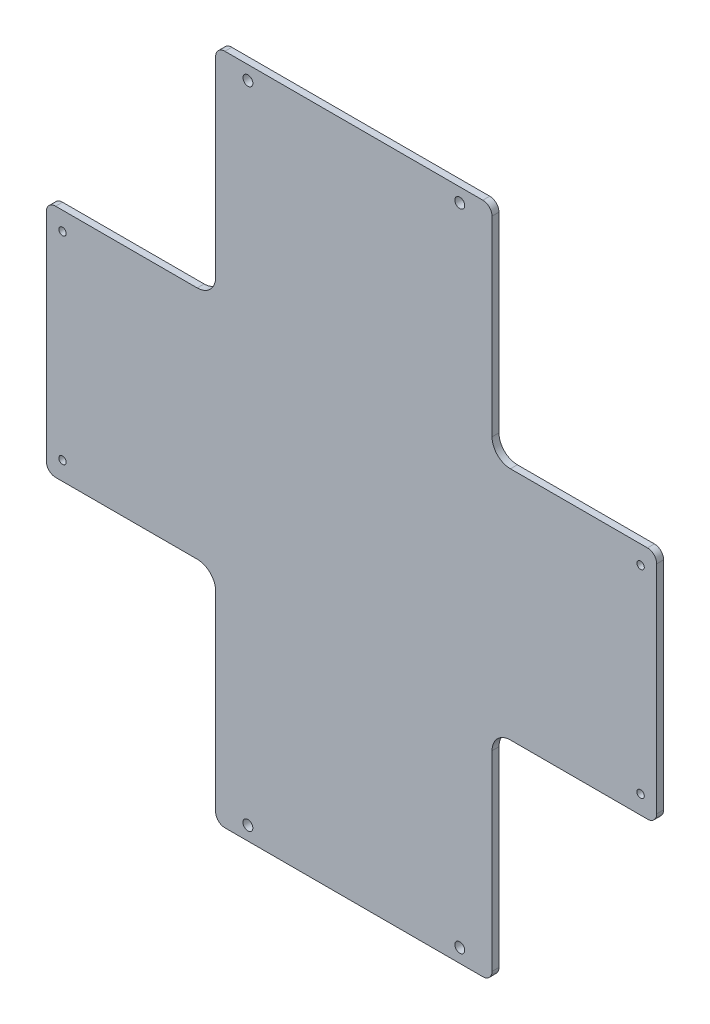
ISO-10303-21;
HEADER;
FILE_DESCRIPTION(('STEP AP214'),'2;1');
FILE_NAME('part.step','',(''),(''),'','','');
FILE_SCHEMA(('AUTOMOTIVE_DESIGN { 1 0 10303 214 1 1 1 1 }'));
ENDSEC;
DATA;
#1=APPLICATION_CONTEXT('core data for automotive mechanical design processes');
#2=APPLICATION_PROTOCOL_DEFINITION('international standard','automotive_design',2000,#1);
#3=PRODUCT_CONTEXT('',#1,'mechanical');
#4=PRODUCT('Part','Part','',(#3));
#5=PRODUCT_RELATED_PRODUCT_CATEGORY('part','',(#4));
#6=PRODUCT_DEFINITION_FORMATION('','',#4);
#7=PRODUCT_DEFINITION_CONTEXT('part definition',#1,'design');
#8=PRODUCT_DEFINITION('design','',#6,#7);
#9=PRODUCT_DEFINITION_SHAPE('','',#8);
#10=(LENGTH_UNIT() NAMED_UNIT(*) SI_UNIT(.MILLI.,.METRE.));
#11=(NAMED_UNIT(*) PLANE_ANGLE_UNIT() SI_UNIT($,.RADIAN.));
#12=(NAMED_UNIT(*) SI_UNIT($,.STERADIAN.) SOLID_ANGLE_UNIT());
#13=UNCERTAINTY_MEASURE_WITH_UNIT(LENGTH_MEASURE(1.E-05),#10,'distance_accuracy_value','');
#14=(GEOMETRIC_REPRESENTATION_CONTEXT(3) GLOBAL_UNCERTAINTY_ASSIGNED_CONTEXT((#13)) GLOBAL_UNIT_ASSIGNED_CONTEXT((#10,
#11,#12)) REPRESENTATION_CONTEXT('',''));
#15=CARTESIAN_POINT('',(0.,0.,0.));
#16=DIRECTION('',(0.,0.,1.));
#17=DIRECTION('',(1.,0.,0.));
#18=AXIS2_PLACEMENT_3D('',#15,#16,#17);
#19=CARTESIAN_POINT('',(-50.,-142.,3.));
#20=DIRECTION('',(0.,0.,1.));
#21=DIRECTION('',(1.,0.,0.));
#22=AXIS2_PLACEMENT_3D('',#19,#20,#21);
#23=PLANE('',#22);
#24=CARTESIAN_POINT('',(-40.,-140.,3.));
#25=DIRECTION('',(0.,0.,1.));
#26=DIRECTION('',(1.,0.,0.));
#27=AXIS2_PLACEMENT_3D('',#24,#25,#26);
#28=CIRCLE('',#27,2.15);
#29=CARTESIAN_POINT('',(-37.85,-140.,3.));
#30=VERTEX_POINT('',#29);
#31=EDGE_CURVE('E546',#30,#30,#28,.T.);
#32=ORIENTED_EDGE('',*,*,#31,.F.);
#33=EDGE_LOOP('',(#32));
#34=FACE_BOUND('',#33,.T.);
#35=CARTESIAN_POINT('',(-120.5,-43.,3.));
#36=DIRECTION('',(0.,0.,1.));
#37=DIRECTION('',(1.,0.,0.));
#38=AXIS2_PLACEMENT_3D('',#35,#36,#37);
#39=CIRCLE('',#38,1.6);
#40=CARTESIAN_POINT('',(-118.9,-43.,3.));
#41=VERTEX_POINT('',#40);
#42=EDGE_CURVE('E565',#41,#41,#39,.T.);
#43=ORIENTED_EDGE('',*,*,#42,.F.);
#44=EDGE_LOOP('',(#43));
#45=FACE_BOUND('',#44,.T.);
#46=CARTESIAN_POINT('',(-120.5,43.,3.));
#47=DIRECTION('',(0.,0.,1.));
#48=DIRECTION('',(1.,0.,0.));
#49=AXIS2_PLACEMENT_3D('',#46,#47,#48);
#50=CIRCLE('',#49,1.6);
#51=CARTESIAN_POINT('',(-118.9,43.,3.));
#52=VERTEX_POINT('',#51);
#53=EDGE_CURVE('E576',#52,#52,#50,.T.);
#54=ORIENTED_EDGE('',*,*,#53,.F.);
#55=EDGE_LOOP('',(#54));
#56=FACE_BOUND('',#55,.T.);
#57=CARTESIAN_POINT('',(-40.,140.,3.));
#58=DIRECTION('',(0.,0.,1.));
#59=DIRECTION('',(1.,0.,0.));
#60=AXIS2_PLACEMENT_3D('',#57,#58,#59);
#61=CIRCLE('',#60,2.15);
#62=CARTESIAN_POINT('',(-37.85,140.,3.));
#63=VERTEX_POINT('',#62);
#64=EDGE_CURVE('E246',#63,#63,#61,.T.);
#65=ORIENTED_EDGE('',*,*,#64,.F.);
#66=EDGE_LOOP('',(#65));
#67=FACE_BOUND('',#66,.T.);
#68=CARTESIAN_POINT('',(-50.,-142.,3.));
#69=DIRECTION('',(0.,0.,1.));
#70=DIRECTION('',(1.,0.,0.));
#71=AXIS2_PLACEMENT_3D('',#68,#69,#70);
#72=CIRCLE('',#71,4.);
#73=CARTESIAN_POINT('',(-54.,-142.,3.));
#74=VERTEX_POINT('',#73);
#75=CARTESIAN_POINT('',(-50.,-146.,3.));
#76=VERTEX_POINT('',#75);
#77=EDGE_CURVE('E314',#74,#76,#72,.T.);
#78=ORIENTED_EDGE('',*,*,#77,.T.);
#79=DIRECTION('',(1.,0.,0.));
#80=VECTOR('',#79,1.);
#81=CARTESIAN_POINT('',(-50.,-146.,3.));
#82=LINE('',#81,#80);
#83=CARTESIAN_POINT('',(62.,-146.,3.));
#84=VERTEX_POINT('',#83);
#85=EDGE_CURVE('E152',#76,#84,#82,.T.);
#86=ORIENTED_EDGE('',*,*,#85,.T.);
#87=CARTESIAN_POINT('',(62.,-142.,3.));
#88=DIRECTION('',(0.,0.,1.));
#89=DIRECTION('',(1.,0.,0.));
#90=AXIS2_PLACEMENT_3D('',#87,#88,#89);
#91=CIRCLE('',#90,4.);
#92=CARTESIAN_POINT('',(66.,-142.,3.));
#93=VERTEX_POINT('',#92);
#94=EDGE_CURVE('E397',#84,#93,#91,.T.);
#95=ORIENTED_EDGE('',*,*,#94,.T.);
#96=DIRECTION('',(0.,1.,0.));
#97=VECTOR('',#96,1.);
#98=CARTESIAN_POINT('',(66.,-142.,3.));
#99=LINE('',#98,#97);
#100=CARTESIAN_POINT('',(66.,-59.,3.));
#101=VERTEX_POINT('',#100);
#102=EDGE_CURVE('E420',#93,#101,#99,.T.);
#103=ORIENTED_EDGE('',*,*,#102,.T.);
#104=CARTESIAN_POINT('',(74.,-59.,3.));
#105=DIRECTION('',(0.,0.,-1.));
#106=DIRECTION('',(-1.,0.,0.));
#107=AXIS2_PLACEMENT_3D('',#104,#105,#106);
#108=CIRCLE('',#107,8.);
#109=CARTESIAN_POINT('',(74.,-51.,3.));
#110=VERTEX_POINT('',#109);
#111=EDGE_CURVE('E414',#101,#110,#108,.T.);
#112=ORIENTED_EDGE('',*,*,#111,.T.);
#113=DIRECTION('',(1.,0.,0.));
#114=VECTOR('',#113,1.);
#115=CARTESIAN_POINT('',(74.,-51.,3.));
#116=LINE('',#115,#114);
#117=CARTESIAN_POINT('',(133.5,-51.,3.));
#118=VERTEX_POINT('',#117);
#119=EDGE_CURVE('E416',#110,#118,#116,.T.);
#120=ORIENTED_EDGE('',*,*,#119,.T.);
#121=CARTESIAN_POINT('',(133.5,-47.,3.));
#122=DIRECTION('',(0.,0.,1.));
#123=DIRECTION('',(1.,0.,0.));
#124=AXIS2_PLACEMENT_3D('',#121,#122,#123);
#125=CIRCLE('',#124,4.);
#126=CARTESIAN_POINT('',(137.5,-47.,3.));
#127=VERTEX_POINT('',#126);
#128=EDGE_CURVE('E421',#118,#127,#125,.T.);
#129=ORIENTED_EDGE('',*,*,#128,.T.);
#130=DIRECTION('',(0.,1.,0.));
#131=VECTOR('',#130,1.);
#132=CARTESIAN_POINT('',(137.5,-47.,3.));
#133=LINE('',#132,#131);
#134=CARTESIAN_POINT('',(137.5,47.,3.));
#135=VERTEX_POINT('',#134);
#136=EDGE_CURVE('E429',#127,#135,#133,.T.);
#137=ORIENTED_EDGE('',*,*,#136,.T.);
#138=CARTESIAN_POINT('',(133.5,47.,3.));
#139=DIRECTION('',(0.,0.,1.));
#140=DIRECTION('',(1.,0.,0.));
#141=AXIS2_PLACEMENT_3D('',#138,#139,#140);
#142=CIRCLE('',#141,4.);
#143=CARTESIAN_POINT('',(133.5,51.,3.));
#144=VERTEX_POINT('',#143);
#145=EDGE_CURVE('E433',#135,#144,#142,.T.);
#146=ORIENTED_EDGE('',*,*,#145,.T.);
#147=DIRECTION('',(-1.,0.,0.));
#148=VECTOR('',#147,1.);
#149=CARTESIAN_POINT('',(133.5,51.,3.));
#150=LINE('',#149,#148);
#151=CARTESIAN_POINT('',(74.,51.,3.));
#152=VERTEX_POINT('',#151);
#153=EDGE_CURVE('E436',#144,#152,#150,.T.);
#154=ORIENTED_EDGE('',*,*,#153,.T.);
#155=CARTESIAN_POINT('',(74.,59.,3.));
#156=DIRECTION('',(0.,0.,-1.));
#157=DIRECTION('',(-1.,0.,0.));
#158=AXIS2_PLACEMENT_3D('',#155,#156,#157);
#159=CIRCLE('',#158,8.);
#160=CARTESIAN_POINT('',(66.,59.,3.));
#161=VERTEX_POINT('',#160);
#162=EDGE_CURVE('E438',#152,#161,#159,.T.);
#163=ORIENTED_EDGE('',*,*,#162,.T.);
#164=DIRECTION('',(0.,1.,0.));
#165=VECTOR('',#164,1.);
#166=CARTESIAN_POINT('',(66.,59.,3.));
#167=LINE('',#166,#165);
#168=CARTESIAN_POINT('',(66.,142.,3.));
#169=VERTEX_POINT('',#168);
#170=EDGE_CURVE('E445',#161,#169,#167,.T.);
#171=ORIENTED_EDGE('',*,*,#170,.T.);
#172=CARTESIAN_POINT('',(62.,142.,3.));
#173=DIRECTION('',(0.,0.,1.));
#174=DIRECTION('',(1.,0.,0.));
#175=AXIS2_PLACEMENT_3D('',#172,#173,#174);
#176=CIRCLE('',#175,4.);
#177=CARTESIAN_POINT('',(62.,146.,3.));
#178=VERTEX_POINT('',#177);
#179=EDGE_CURVE('E443',#169,#178,#176,.T.);
#180=ORIENTED_EDGE('',*,*,#179,.T.);
#181=DIRECTION('',(-1.,0.,0.));
#182=VECTOR('',#181,1.);
#183=CARTESIAN_POINT('',(62.,146.,3.));
#184=LINE('',#183,#182);
#185=CARTESIAN_POINT('',(-50.,146.,3.));
#186=VERTEX_POINT('',#185);
#187=EDGE_CURVE('E449',#178,#186,#184,.T.);
#188=ORIENTED_EDGE('',*,*,#187,.T.);
#189=CARTESIAN_POINT('',(-50.,142.,3.));
#190=DIRECTION('',(0.,0.,1.));
#191=DIRECTION('',(1.,0.,0.));
#192=AXIS2_PLACEMENT_3D('',#189,#190,#191);
#193=CIRCLE('',#192,4.);
#194=CARTESIAN_POINT('',(-54.,142.,3.));
#195=VERTEX_POINT('',#194);
#196=EDGE_CURVE('E453',#186,#195,#193,.T.);
#197=ORIENTED_EDGE('',*,*,#196,.T.);
#198=DIRECTION('',(0.,-1.,0.));
#199=VECTOR('',#198,1.);
#200=CARTESIAN_POINT('',(-54.,142.,3.));
#201=LINE('',#200,#199);
#202=CARTESIAN_POINT('',(-54.,59.,3.));
#203=VERTEX_POINT('',#202);
#204=EDGE_CURVE('E452',#195,#203,#201,.T.);
#205=ORIENTED_EDGE('',*,*,#204,.T.);
#206=CARTESIAN_POINT('',(-62.,59.,3.));
#207=DIRECTION('',(0.,0.,-1.));
#208=DIRECTION('',(-1.,0.,0.));
#209=AXIS2_PLACEMENT_3D('',#206,#207,#208);
#210=CIRCLE('',#209,8.);
#211=CARTESIAN_POINT('',(-62.,51.,3.));
#212=VERTEX_POINT('',#211);
#213=EDGE_CURVE('E460',#203,#212,#210,.T.);
#214=ORIENTED_EDGE('',*,*,#213,.T.);
#215=DIRECTION('',(-1.,0.,0.));
#216=VECTOR('',#215,1.);
#217=CARTESIAN_POINT('',(-62.,51.,3.));
#218=LINE('',#217,#216);
#219=CARTESIAN_POINT('',(-123.5,51.,3.));
#220=VERTEX_POINT('',#219);
#221=EDGE_CURVE('E458',#212,#220,#218,.T.);
#222=ORIENTED_EDGE('',*,*,#221,.T.);
#223=CARTESIAN_POINT('',(-123.5,47.,3.));
#224=DIRECTION('',(0.,0.,1.));
#225=DIRECTION('',(1.,0.,0.));
#226=AXIS2_PLACEMENT_3D('',#223,#224,#225);
#227=CIRCLE('',#226,4.);
#228=CARTESIAN_POINT('',(-127.5,47.,3.));
#229=VERTEX_POINT('',#228);
#230=EDGE_CURVE('E464',#220,#229,#227,.T.);
#231=ORIENTED_EDGE('',*,*,#230,.T.);
#232=DIRECTION('',(0.,-1.,0.));
#233=VECTOR('',#232,1.);
#234=CARTESIAN_POINT('',(-127.5,47.,3.));
#235=LINE('',#234,#233);
#236=CARTESIAN_POINT('',(-127.5,-47.,3.));
#237=VERTEX_POINT('',#236);
#238=EDGE_CURVE('E468',#229,#237,#235,.T.);
#239=ORIENTED_EDGE('',*,*,#238,.T.);
#240=CARTESIAN_POINT('',(-123.5,-47.,3.));
#241=DIRECTION('',(0.,0.,1.));
#242=DIRECTION('',(1.,0.,0.));
#243=AXIS2_PLACEMENT_3D('',#240,#241,#242);
#244=CIRCLE('',#243,4.);
#245=CARTESIAN_POINT('',(-123.5,-51.,3.));
#246=VERTEX_POINT('',#245);
#247=EDGE_CURVE('E222',#237,#246,#244,.T.);
#248=ORIENTED_EDGE('',*,*,#247,.T.);
#249=DIRECTION('',(1.,0.,0.));
#250=VECTOR('',#249,1.);
#251=CARTESIAN_POINT('',(-123.5,-51.,3.));
#252=LINE('',#251,#250);
#253=CARTESIAN_POINT('',(-62.,-51.,3.));
#254=VERTEX_POINT('',#253);
#255=EDGE_CURVE('E214',#246,#254,#252,.T.);
#256=ORIENTED_EDGE('',*,*,#255,.T.);
#257=CARTESIAN_POINT('',(-62.,-59.,3.));
#258=DIRECTION('',(0.,0.,-1.));
#259=DIRECTION('',(-1.,0.,0.));
#260=AXIS2_PLACEMENT_3D('',#257,#258,#259);
#261=CIRCLE('',#260,8.);
#262=CARTESIAN_POINT('',(-54.,-59.,3.));
#263=VERTEX_POINT('',#262);
#264=EDGE_CURVE('E218',#254,#263,#261,.T.);
#265=ORIENTED_EDGE('',*,*,#264,.T.);
#266=DIRECTION('',(0.,-1.,0.));
#267=VECTOR('',#266,1.);
#268=CARTESIAN_POINT('',(-54.,-59.,3.));
#269=LINE('',#268,#267);
#270=EDGE_CURVE('E64',#263,#74,#269,.T.);
#271=ORIENTED_EDGE('',*,*,#270,.T.);
#272=EDGE_LOOP('',(#78,#86,#95,#103,#112,#120,#129,#137,#146,#154,#163,#171,#180,#188,#197,#205,
#214,#222,#231,#239,#248,#256,#265,#271));
#273=FACE_BOUND('',#272,.T.);
#274=CARTESIAN_POINT('',(52.,140.,3.));
#275=DIRECTION('',(0.,0.,1.));
#276=DIRECTION('',(1.,0.,0.));
#277=AXIS2_PLACEMENT_3D('',#274,#275,#276);
#278=CIRCLE('',#277,2.15);
#279=CARTESIAN_POINT('',(54.15,140.,3.));
#280=VERTEX_POINT('',#279);
#281=EDGE_CURVE('E588',#280,#280,#278,.T.);
#282=ORIENTED_EDGE('',*,*,#281,.F.);
#283=EDGE_LOOP('',(#282));
#284=FACE_BOUND('',#283,.T.);
#285=CARTESIAN_POINT('',(130.5,43.,3.));
#286=DIRECTION('',(0.,0.,1.));
#287=DIRECTION('',(1.,0.,0.));
#288=AXIS2_PLACEMENT_3D('',#285,#286,#287);
#289=CIRCLE('',#288,1.59999999999999);
#290=CARTESIAN_POINT('',(132.1,43.,3.));
#291=VERTEX_POINT('',#290);
#292=EDGE_CURVE('E568',#291,#291,#289,.T.);
#293=ORIENTED_EDGE('',*,*,#292,.F.);
#294=EDGE_LOOP('',(#293));
#295=FACE_BOUND('',#294,.T.);
#296=CARTESIAN_POINT('',(130.5,-43.,3.));
#297=DIRECTION('',(0.,0.,1.));
#298=DIRECTION('',(1.,0.,0.));
#299=AXIS2_PLACEMENT_3D('',#296,#297,#298);
#300=CIRCLE('',#299,1.59999999999999);
#301=CARTESIAN_POINT('',(132.1,-43.,3.));
#302=VERTEX_POINT('',#301);
#303=EDGE_CURVE('E551',#302,#302,#300,.T.);
#304=ORIENTED_EDGE('',*,*,#303,.F.);
#305=EDGE_LOOP('',(#304));
#306=FACE_BOUND('',#305,.T.);
#307=CARTESIAN_POINT('',(52.,-140.,3.));
#308=DIRECTION('',(0.,0.,1.));
#309=DIRECTION('',(1.,0.,0.));
#310=AXIS2_PLACEMENT_3D('',#307,#308,#309);
#311=CIRCLE('',#310,2.15);
#312=CARTESIAN_POINT('',(54.15,-140.,3.));
#313=VERTEX_POINT('',#312);
#314=EDGE_CURVE('E532',#313,#313,#311,.T.);
#315=ORIENTED_EDGE('',*,*,#314,.F.);
#316=EDGE_LOOP('',(#315));
#317=FACE_BOUND('',#316,.T.);
#318=ADVANCED_FACE('F44',(#34,#45,#56,#67,#273,#284,#295,#306,#317),#23,.T.);
#319=CARTESIAN_POINT('',(-50.,-142.,0.));
#320=DIRECTION('',(0.,0.,1.));
#321=DIRECTION('',(1.,0.,0.));
#322=AXIS2_PLACEMENT_3D('',#319,#320,#321);
#323=PLANE('',#322);
#324=CARTESIAN_POINT('',(-50.,-142.,0.));
#325=DIRECTION('',(0.,0.,1.));
#326=DIRECTION('',(1.,0.,0.));
#327=AXIS2_PLACEMENT_3D('',#324,#325,#326);
#328=CIRCLE('',#327,4.);
#329=CARTESIAN_POINT('',(-54.,-142.,0.));
#330=VERTEX_POINT('',#329);
#331=CARTESIAN_POINT('',(-50.,-146.,0.));
#332=VERTEX_POINT('',#331);
#333=EDGE_CURVE('E244',#330,#332,#328,.T.);
#334=ORIENTED_EDGE('',*,*,#333,.F.);
#335=DIRECTION('',(0.,-1.,0.));
#336=VECTOR('',#335,1.);
#337=CARTESIAN_POINT('',(-54.,-59.,0.));
#338=LINE('',#337,#336);
#339=CARTESIAN_POINT('',(-54.,-59.,0.));
#340=VERTEX_POINT('',#339);
#341=EDGE_CURVE('E148',#340,#330,#338,.T.);
#342=ORIENTED_EDGE('',*,*,#341,.F.);
#343=CARTESIAN_POINT('',(-62.,-59.,0.));
#344=DIRECTION('',(0.,0.,-1.));
#345=DIRECTION('',(-1.,0.,0.));
#346=AXIS2_PLACEMENT_3D('',#343,#344,#345);
#347=CIRCLE('',#346,8.);
#348=CARTESIAN_POINT('',(-62.,-51.,0.));
#349=VERTEX_POINT('',#348);
#350=EDGE_CURVE('E139',#349,#340,#347,.T.);
#351=ORIENTED_EDGE('',*,*,#350,.F.);
#352=DIRECTION('',(1.,0.,0.));
#353=VECTOR('',#352,1.);
#354=CARTESIAN_POINT('',(-123.5,-51.,0.));
#355=LINE('',#354,#353);
#356=CARTESIAN_POINT('',(-123.5,-51.,0.));
#357=VERTEX_POINT('',#356);
#358=EDGE_CURVE('E230',#357,#349,#355,.T.);
#359=ORIENTED_EDGE('',*,*,#358,.F.);
#360=CARTESIAN_POINT('',(-123.5,-47.,0.));
#361=DIRECTION('',(0.,0.,1.));
#362=DIRECTION('',(1.,0.,0.));
#363=AXIS2_PLACEMENT_3D('',#360,#361,#362);
#364=CIRCLE('',#363,4.);
#365=CARTESIAN_POINT('',(-127.5,-47.,0.));
#366=VERTEX_POINT('',#365);
#367=EDGE_CURVE('E304',#366,#357,#364,.T.);
#368=ORIENTED_EDGE('',*,*,#367,.F.);
#369=DIRECTION('',(0.,-1.,0.));
#370=VECTOR('',#369,1.);
#371=CARTESIAN_POINT('',(-127.5,47.,0.));
#372=LINE('',#371,#370);
#373=CARTESIAN_POINT('',(-127.5,47.,0.));
#374=VERTEX_POINT('',#373);
#375=EDGE_CURVE('E305',#374,#366,#372,.T.);
#376=ORIENTED_EDGE('',*,*,#375,.F.);
#377=CARTESIAN_POINT('',(-123.5,47.,0.));
#378=DIRECTION('',(0.,0.,1.));
#379=DIRECTION('',(1.,0.,0.));
#380=AXIS2_PLACEMENT_3D('',#377,#378,#379);
#381=CIRCLE('',#380,4.);
#382=CARTESIAN_POINT('',(-123.5,51.,0.));
#383=VERTEX_POINT('',#382);
#384=EDGE_CURVE('E298',#383,#374,#381,.T.);
#385=ORIENTED_EDGE('',*,*,#384,.F.);
#386=DIRECTION('',(-1.,0.,0.));
#387=VECTOR('',#386,1.);
#388=CARTESIAN_POINT('',(-62.,51.,0.));
#389=LINE('',#388,#387);
#390=CARTESIAN_POINT('',(-62.,51.,0.));
#391=VERTEX_POINT('',#390);
#392=EDGE_CURVE('E296',#391,#383,#389,.T.);
#393=ORIENTED_EDGE('',*,*,#392,.F.);
#394=CARTESIAN_POINT('',(-62.,59.,0.));
#395=DIRECTION('',(0.,0.,-1.));
#396=DIRECTION('',(-1.,0.,0.));
#397=AXIS2_PLACEMENT_3D('',#394,#395,#396);
#398=CIRCLE('',#397,8.);
#399=CARTESIAN_POINT('',(-54.,59.,0.));
#400=VERTEX_POINT('',#399);
#401=EDGE_CURVE('E291',#400,#391,#398,.T.);
#402=ORIENTED_EDGE('',*,*,#401,.F.);
#403=DIRECTION('',(0.,-1.,0.));
#404=VECTOR('',#403,1.);
#405=CARTESIAN_POINT('',(-54.,142.,0.));
#406=LINE('',#405,#404);
#407=CARTESIAN_POINT('',(-54.,142.,0.));
#408=VERTEX_POINT('',#407);
#409=EDGE_CURVE('E289',#408,#400,#406,.T.);
#410=ORIENTED_EDGE('',*,*,#409,.F.);
#411=CARTESIAN_POINT('',(-50.,142.,0.));
#412=DIRECTION('',(0.,0.,1.));
#413=DIRECTION('',(1.,0.,0.));
#414=AXIS2_PLACEMENT_3D('',#411,#412,#413);
#415=CIRCLE('',#414,4.);
#416=CARTESIAN_POINT('',(-50.,146.,0.));
#417=VERTEX_POINT('',#416);
#418=EDGE_CURVE('E290',#417,#408,#415,.T.);
#419=ORIENTED_EDGE('',*,*,#418,.F.);
#420=DIRECTION('',(-1.,0.,0.));
#421=VECTOR('',#420,1.);
#422=CARTESIAN_POINT('',(62.,146.,0.));
#423=LINE('',#422,#421);
#424=CARTESIAN_POINT('',(62.,146.,0.));
#425=VERTEX_POINT('',#424);
#426=EDGE_CURVE('E283',#425,#417,#423,.T.);
#427=ORIENTED_EDGE('',*,*,#426,.F.);
#428=CARTESIAN_POINT('',(62.,142.,0.));
#429=DIRECTION('',(0.,0.,1.));
#430=DIRECTION('',(1.,0.,0.));
#431=AXIS2_PLACEMENT_3D('',#428,#429,#430);
#432=CIRCLE('',#431,4.);
#433=CARTESIAN_POINT('',(66.,142.,0.));
#434=VERTEX_POINT('',#433);
#435=EDGE_CURVE('E281',#434,#425,#432,.T.);
#436=ORIENTED_EDGE('',*,*,#435,.F.);
#437=DIRECTION('',(0.,1.,0.));
#438=VECTOR('',#437,1.);
#439=CARTESIAN_POINT('',(66.,59.,0.));
#440=LINE('',#439,#438);
#441=CARTESIAN_POINT('',(66.,59.,0.));
#442=VERTEX_POINT('',#441);
#443=EDGE_CURVE('E279',#442,#434,#440,.T.);
#444=ORIENTED_EDGE('',*,*,#443,.F.);
#445=CARTESIAN_POINT('',(74.,59.,0.));
#446=DIRECTION('',(0.,0.,-1.));
#447=DIRECTION('',(-1.,0.,0.));
#448=AXIS2_PLACEMENT_3D('',#445,#446,#447);
#449=CIRCLE('',#448,8.);
#450=CARTESIAN_POINT('',(74.,51.,0.));
#451=VERTEX_POINT('',#450);
#452=EDGE_CURVE('E274',#451,#442,#449,.T.);
#453=ORIENTED_EDGE('',*,*,#452,.F.);
#454=DIRECTION('',(-1.,0.,0.));
#455=VECTOR('',#454,1.);
#456=CARTESIAN_POINT('',(133.5,51.,0.));
#457=LINE('',#456,#455);
#458=CARTESIAN_POINT('',(133.5,51.,0.));
#459=VERTEX_POINT('',#458);
#460=EDGE_CURVE('E275',#459,#451,#457,.T.);
#461=ORIENTED_EDGE('',*,*,#460,.F.);
#462=CARTESIAN_POINT('',(133.5,47.,0.));
#463=DIRECTION('',(0.,0.,1.));
#464=DIRECTION('',(1.,0.,0.));
#465=AXIS2_PLACEMENT_3D('',#462,#463,#464);
#466=CIRCLE('',#465,4.);
#467=CARTESIAN_POINT('',(137.5,47.,0.));
#468=VERTEX_POINT('',#467);
#469=EDGE_CURVE('E267',#468,#459,#466,.T.);
#470=ORIENTED_EDGE('',*,*,#469,.F.);
#471=DIRECTION('',(0.,1.,0.));
#472=VECTOR('',#471,1.);
#473=CARTESIAN_POINT('',(137.5,-47.,0.));
#474=LINE('',#473,#472);
#475=CARTESIAN_POINT('',(137.5,-47.,0.));
#476=VERTEX_POINT('',#475);
#477=EDGE_CURVE('E266',#476,#468,#474,.T.);
#478=ORIENTED_EDGE('',*,*,#477,.F.);
#479=CARTESIAN_POINT('',(133.5,-47.,0.));
#480=DIRECTION('',(0.,0.,1.));
#481=DIRECTION('',(1.,0.,0.));
#482=AXIS2_PLACEMENT_3D('',#479,#480,#481);
#483=CIRCLE('',#482,4.);
#484=CARTESIAN_POINT('',(133.5,-51.,0.));
#485=VERTEX_POINT('',#484);
#486=EDGE_CURVE('E263',#485,#476,#483,.T.);
#487=ORIENTED_EDGE('',*,*,#486,.F.);
#488=DIRECTION('',(1.,0.,0.));
#489=VECTOR('',#488,1.);
#490=CARTESIAN_POINT('',(74.,-51.,0.));
#491=LINE('',#490,#489);
#492=CARTESIAN_POINT('',(74.,-51.,0.));
#493=VERTEX_POINT('',#492);
#494=EDGE_CURVE('E257',#493,#485,#491,.T.);
#495=ORIENTED_EDGE('',*,*,#494,.F.);
#496=CARTESIAN_POINT('',(74.,-59.,0.));
#497=DIRECTION('',(0.,0.,-1.));
#498=DIRECTION('',(-1.,0.,0.));
#499=AXIS2_PLACEMENT_3D('',#496,#497,#498);
#500=CIRCLE('',#499,8.);
#501=CARTESIAN_POINT('',(66.,-59.,0.));
#502=VERTEX_POINT('',#501);
#503=EDGE_CURVE('E260',#502,#493,#500,.T.);
#504=ORIENTED_EDGE('',*,*,#503,.F.);
#505=DIRECTION('',(0.,1.,0.));
#506=VECTOR('',#505,1.);
#507=CARTESIAN_POINT('',(66.,-142.,0.));
#508=LINE('',#507,#506);
#509=CARTESIAN_POINT('',(66.,-142.,0.));
#510=VERTEX_POINT('',#509);
#511=EDGE_CURVE('E255',#510,#502,#508,.T.);
#512=ORIENTED_EDGE('',*,*,#511,.F.);
#513=CARTESIAN_POINT('',(62.,-142.,0.));
#514=DIRECTION('',(0.,0.,1.));
#515=DIRECTION('',(1.,0.,0.));
#516=AXIS2_PLACEMENT_3D('',#513,#514,#515);
#517=CIRCLE('',#516,4.);
#518=CARTESIAN_POINT('',(62.,-146.,0.));
#519=VERTEX_POINT('',#518);
#520=EDGE_CURVE('E253',#519,#510,#517,.T.);
#521=ORIENTED_EDGE('',*,*,#520,.F.);
#522=DIRECTION('',(1.,0.,0.));
#523=VECTOR('',#522,1.);
#524=CARTESIAN_POINT('',(-50.,-146.,0.));
#525=LINE('',#524,#523);
#526=EDGE_CURVE('E250',#332,#519,#525,.T.);
#527=ORIENTED_EDGE('',*,*,#526,.F.);
#528=EDGE_LOOP('',(#334,#342,#351,#359,#368,#376,#385,#393,#402,#410,#419,#427,#436,#444,#453,
#461,#470,#478,#487,#495,#504,#512,#521,#527));
#529=FACE_BOUND('',#528,.T.);
#530=CARTESIAN_POINT('',(-40.,140.,0.));
#531=DIRECTION('',(0.,0.,1.));
#532=DIRECTION('',(1.,0.,0.));
#533=AXIS2_PLACEMENT_3D('',#530,#531,#532);
#534=CIRCLE('',#533,2.15);
#535=CARTESIAN_POINT('',(-37.85,140.,0.));
#536=VERTEX_POINT('',#535);
#537=EDGE_CURVE('E587',#536,#536,#534,.T.);
#538=ORIENTED_EDGE('',*,*,#537,.T.);
#539=EDGE_LOOP('',(#538));
#540=FACE_BOUND('',#539,.T.);
#541=CARTESIAN_POINT('',(52.,140.,0.));
#542=DIRECTION('',(0.,0.,1.));
#543=DIRECTION('',(1.,0.,0.));
#544=AXIS2_PLACEMENT_3D('',#541,#542,#543);
#545=CIRCLE('',#544,2.15);
#546=CARTESIAN_POINT('',(54.15,140.,0.));
#547=VERTEX_POINT('',#546);
#548=EDGE_CURVE('E582',#547,#547,#545,.T.);
#549=ORIENTED_EDGE('',*,*,#548,.T.);
#550=EDGE_LOOP('',(#549));
#551=FACE_BOUND('',#550,.T.);
#552=CARTESIAN_POINT('',(-120.5,43.,0.));
#553=DIRECTION('',(0.,0.,1.));
#554=DIRECTION('',(1.,0.,0.));
#555=AXIS2_PLACEMENT_3D('',#552,#553,#554);
#556=CIRCLE('',#555,1.6);
#557=CARTESIAN_POINT('',(-118.9,43.,0.));
#558=VERTEX_POINT('',#557);
#559=EDGE_CURVE('E573',#558,#558,#556,.T.);
#560=ORIENTED_EDGE('',*,*,#559,.T.);
#561=EDGE_LOOP('',(#560));
#562=FACE_BOUND('',#561,.T.);
#563=CARTESIAN_POINT('',(130.5,43.,0.));
#564=DIRECTION('',(0.,0.,1.));
#565=DIRECTION('',(1.,0.,0.));
#566=AXIS2_PLACEMENT_3D('',#563,#564,#565);
#567=CIRCLE('',#566,1.59999999999999);
#568=CARTESIAN_POINT('',(132.1,43.,0.));
#569=VERTEX_POINT('',#568);
#570=EDGE_CURVE('E567',#569,#569,#567,.T.);
#571=ORIENTED_EDGE('',*,*,#570,.T.);
#572=EDGE_LOOP('',(#571));
#573=FACE_BOUND('',#572,.T.);
#574=CARTESIAN_POINT('',(-120.5,-43.,0.));
#575=DIRECTION('',(0.,0.,1.));
#576=DIRECTION('',(1.,0.,0.));
#577=AXIS2_PLACEMENT_3D('',#574,#575,#576);
#578=CIRCLE('',#577,1.6);
#579=CARTESIAN_POINT('',(-118.9,-43.,0.));
#580=VERTEX_POINT('',#579);
#581=EDGE_CURVE('E559',#580,#580,#578,.T.);
#582=ORIENTED_EDGE('',*,*,#581,.T.);
#583=EDGE_LOOP('',(#582));
#584=FACE_BOUND('',#583,.T.);
#585=CARTESIAN_POINT('',(130.5,-43.,0.));
#586=DIRECTION('',(0.,0.,1.));
#587=DIRECTION('',(1.,0.,0.));
#588=AXIS2_PLACEMENT_3D('',#585,#586,#587);
#589=CIRCLE('',#588,1.59999999999999);
#590=CARTESIAN_POINT('',(132.1,-43.,0.));
#591=VERTEX_POINT('',#590);
#592=EDGE_CURVE('E549',#591,#591,#589,.T.);
#593=ORIENTED_EDGE('',*,*,#592,.T.);
#594=EDGE_LOOP('',(#593));
#595=FACE_BOUND('',#594,.T.);
#596=CARTESIAN_POINT('',(-40.,-140.,0.));
#597=DIRECTION('',(0.,0.,1.));
#598=DIRECTION('',(1.,0.,0.));
#599=AXIS2_PLACEMENT_3D('',#596,#597,#598);
#600=CIRCLE('',#599,2.15);
#601=CARTESIAN_POINT('',(-37.85,-140.,0.));
#602=VERTEX_POINT('',#601);
#603=EDGE_CURVE('E543',#602,#602,#600,.T.);
#604=ORIENTED_EDGE('',*,*,#603,.T.);
#605=EDGE_LOOP('',(#604));
#606=FACE_BOUND('',#605,.T.);
#607=CARTESIAN_POINT('',(52.,-140.,0.));
#608=DIRECTION('',(0.,0.,1.));
#609=DIRECTION('',(1.,0.,0.));
#610=AXIS2_PLACEMENT_3D('',#607,#608,#609);
#611=CIRCLE('',#610,2.15);
#612=CARTESIAN_POINT('',(54.15,-140.,0.));
#613=VERTEX_POINT('',#612);
#614=EDGE_CURVE('E538',#613,#613,#611,.T.);
#615=ORIENTED_EDGE('',*,*,#614,.T.);
#616=EDGE_LOOP('',(#615));
#617=FACE_BOUND('',#616,.T.);
#618=ADVANCED_FACE('F401',(#529,#540,#551,#562,#573,#584,#595,#606,#617),#323,.F.);
#619=CARTESIAN_POINT('',(-50.,-142.,3.));
#620=DIRECTION('',(0.,0.,-1.));
#621=DIRECTION('',(-1.,0.,0.));
#622=AXIS2_PLACEMENT_3D('',#619,#620,#621);
#623=CYLINDRICAL_SURFACE('',#622,4.);
#624=ORIENTED_EDGE('',*,*,#333,.T.);
#625=DIRECTION('',(0.,0.,-1.));
#626=VECTOR('',#625,1.);
#627=CARTESIAN_POINT('',(-50.,-146.,3.));
#628=LINE('',#627,#626);
#629=EDGE_CURVE('E11',#76,#332,#628,.T.);
#630=ORIENTED_EDGE('',*,*,#629,.F.);
#631=ORIENTED_EDGE('',*,*,#77,.F.);
#632=DIRECTION('',(0.,0.,-1.));
#633=VECTOR('',#632,1.);
#634=CARTESIAN_POINT('',(-54.,-142.,3.));
#635=LINE('',#634,#633);
#636=EDGE_CURVE('E239',#74,#330,#635,.T.);
#637=ORIENTED_EDGE('',*,*,#636,.T.);
#638=EDGE_LOOP('',(#624,#630,#631,#637));
#639=FACE_BOUND('',#638,.T.);
#640=ADVANCED_FACE('F50',(#639),#623,.T.);
#641=CARTESIAN_POINT('',(-50.,-146.,3.));
#642=DIRECTION('',(0.,1.,0.));
#643=DIRECTION('',(0.,0.,1.));
#644=AXIS2_PLACEMENT_3D('',#641,#642,#643);
#645=PLANE('',#644);
#646=ORIENTED_EDGE('',*,*,#526,.T.);
#647=DIRECTION('',(0.,0.,-1.));
#648=VECTOR('',#647,1.);
#649=CARTESIAN_POINT('',(62.,-146.,3.));
#650=LINE('',#649,#648);
#651=EDGE_CURVE('E54',#84,#519,#650,.T.);
#652=ORIENTED_EDGE('',*,*,#651,.F.);
#653=ORIENTED_EDGE('',*,*,#85,.F.);
#654=ORIENTED_EDGE('',*,*,#629,.T.);
#655=EDGE_LOOP('',(#646,#652,#653,#654));
#656=FACE_BOUND('',#655,.T.);
#657=ADVANCED_FACE('F869',(#656),#645,.F.);
#658=CARTESIAN_POINT('',(62.,-142.,3.));
#659=DIRECTION('',(0.,0.,-1.));
#660=DIRECTION('',(-1.,0.,0.));
#661=AXIS2_PLACEMENT_3D('',#658,#659,#660);
#662=CYLINDRICAL_SURFACE('',#661,4.);
#663=ORIENTED_EDGE('',*,*,#520,.T.);
#664=DIRECTION('',(0.,0.,-1.));
#665=VECTOR('',#664,1.);
#666=CARTESIAN_POINT('',(66.,-142.,3.));
#667=LINE('',#666,#665);
#668=EDGE_CURVE('E386',#93,#510,#667,.T.);
#669=ORIENTED_EDGE('',*,*,#668,.F.);
#670=ORIENTED_EDGE('',*,*,#94,.F.);
#671=ORIENTED_EDGE('',*,*,#651,.T.);
#672=EDGE_LOOP('',(#663,#669,#670,#671));
#673=FACE_BOUND('',#672,.T.);
#674=ADVANCED_FACE('F400',(#673),#662,.T.);
#675=CARTESIAN_POINT('',(66.,-142.,3.));
#676=DIRECTION('',(-1.,0.,0.));
#677=DIRECTION('',(0.,0.,1.));
#678=AXIS2_PLACEMENT_3D('',#675,#676,#677);
#679=PLANE('',#678);
#680=ORIENTED_EDGE('',*,*,#511,.T.);
#681=DIRECTION('',(0.,0.,-1.));
#682=VECTOR('',#681,1.);
#683=CARTESIAN_POINT('',(66.,-59.,3.));
#684=LINE('',#683,#682);
#685=EDGE_CURVE('E384',#101,#502,#684,.T.);
#686=ORIENTED_EDGE('',*,*,#685,.F.);
#687=ORIENTED_EDGE('',*,*,#102,.F.);
#688=ORIENTED_EDGE('',*,*,#668,.T.);
#689=EDGE_LOOP('',(#680,#686,#687,#688));
#690=FACE_BOUND('',#689,.T.);
#691=ADVANCED_FACE('F408',(#690),#679,.F.);
#692=CARTESIAN_POINT('',(74.,-59.,3.));
#693=DIRECTION('',(0.,0.,-1.));
#694=DIRECTION('',(-1.,0.,0.));
#695=AXIS2_PLACEMENT_3D('',#692,#693,#694);
#696=CYLINDRICAL_SURFACE('',#695,8.);
#697=ORIENTED_EDGE('',*,*,#503,.T.);
#698=DIRECTION('',(0.,0.,-1.));
#699=VECTOR('',#698,1.);
#700=CARTESIAN_POINT('',(74.,-51.,3.));
#701=LINE('',#700,#699);
#702=EDGE_CURVE('E381',#110,#493,#701,.T.);
#703=ORIENTED_EDGE('',*,*,#702,.F.);
#704=ORIENTED_EDGE('',*,*,#111,.F.);
#705=ORIENTED_EDGE('',*,*,#685,.T.);
#706=EDGE_LOOP('',(#697,#703,#704,#705));
#707=FACE_BOUND('',#706,.T.);
#708=ADVANCED_FACE('F411',(#707),#696,.F.);
#709=CARTESIAN_POINT('',(74.,-51.,3.));
#710=DIRECTION('',(0.,1.,0.));
#711=DIRECTION('',(0.,0.,1.));
#712=AXIS2_PLACEMENT_3D('',#709,#710,#711);
#713=PLANE('',#712);
#714=ORIENTED_EDGE('',*,*,#494,.T.);
#715=DIRECTION('',(0.,0.,-1.));
#716=VECTOR('',#715,1.);
#717=CARTESIAN_POINT('',(133.5,-51.,3.));
#718=LINE('',#717,#716);
#719=EDGE_CURVE('E380',#118,#485,#718,.T.);
#720=ORIENTED_EDGE('',*,*,#719,.F.);
#721=ORIENTED_EDGE('',*,*,#119,.F.);
#722=ORIENTED_EDGE('',*,*,#702,.T.);
#723=EDGE_LOOP('',(#714,#720,#721,#722));
#724=FACE_BOUND('',#723,.T.);
#725=ADVANCED_FACE('F835',(#724),#713,.F.);
#726=CARTESIAN_POINT('',(133.5,-47.,3.));
#727=DIRECTION('',(0.,0.,-1.));
#728=DIRECTION('',(-1.,0.,0.));
#729=AXIS2_PLACEMENT_3D('',#726,#727,#728);
#730=CYLINDRICAL_SURFACE('',#729,4.);
#731=ORIENTED_EDGE('',*,*,#486,.T.);
#732=DIRECTION('',(0.,0.,-1.));
#733=VECTOR('',#732,1.);
#734=CARTESIAN_POINT('',(137.5,-47.,3.));
#735=LINE('',#734,#733);
#736=EDGE_CURVE('E373',#127,#476,#735,.T.);
#737=ORIENTED_EDGE('',*,*,#736,.F.);
#738=ORIENTED_EDGE('',*,*,#128,.F.);
#739=ORIENTED_EDGE('',*,*,#719,.T.);
#740=EDGE_LOOP('',(#731,#737,#738,#739));
#741=FACE_BOUND('',#740,.T.);
#742=ADVANCED_FACE('F824',(#741),#730,.T.);
#743=CARTESIAN_POINT('',(137.5,-47.,3.));
#744=DIRECTION('',(-1.,0.,0.));
#745=DIRECTION('',(0.,0.,1.));
#746=AXIS2_PLACEMENT_3D('',#743,#744,#745);
#747=PLANE('',#746);
#748=ORIENTED_EDGE('',*,*,#477,.T.);
#749=DIRECTION('',(0.,0.,-1.));
#750=VECTOR('',#749,1.);
#751=CARTESIAN_POINT('',(137.5,47.,3.));
#752=LINE('',#751,#750);
#753=EDGE_CURVE('E369',#135,#468,#752,.T.);
#754=ORIENTED_EDGE('',*,*,#753,.F.);
#755=ORIENTED_EDGE('',*,*,#136,.F.);
#756=ORIENTED_EDGE('',*,*,#736,.T.);
#757=EDGE_LOOP('',(#748,#754,#755,#756));
#758=FACE_BOUND('',#757,.T.);
#759=ADVANCED_FACE('F814',(#758),#747,.F.);
#760=CARTESIAN_POINT('',(133.5,47.,3.));
#761=DIRECTION('',(0.,0.,-1.));
#762=DIRECTION('',(-1.,0.,0.));
#763=AXIS2_PLACEMENT_3D('',#760,#761,#762);
#764=CYLINDRICAL_SURFACE('',#763,4.);
#765=ORIENTED_EDGE('',*,*,#469,.T.);
#766=DIRECTION('',(0.,0.,-1.));
#767=VECTOR('',#766,1.);
#768=CARTESIAN_POINT('',(133.5,51.,3.));
#769=LINE('',#768,#767);
#770=EDGE_CURVE('E364',#144,#459,#769,.T.);
#771=ORIENTED_EDGE('',*,*,#770,.F.);
#772=ORIENTED_EDGE('',*,*,#145,.F.);
#773=ORIENTED_EDGE('',*,*,#753,.T.);
#774=EDGE_LOOP('',(#765,#771,#772,#773));
#775=FACE_BOUND('',#774,.T.);
#776=ADVANCED_FACE('F804',(#775),#764,.T.);
#777=CARTESIAN_POINT('',(133.5,51.,3.));
#778=DIRECTION('',(0.,-1.,0.));
#779=DIRECTION('',(0.,0.,-1.));
#780=AXIS2_PLACEMENT_3D('',#777,#778,#779);
#781=PLANE('',#780);
#782=ORIENTED_EDGE('',*,*,#460,.T.);
#783=DIRECTION('',(0.,0.,-1.));
#784=VECTOR('',#783,1.);
#785=CARTESIAN_POINT('',(74.,51.,3.));
#786=LINE('',#785,#784);
#787=EDGE_CURVE('E363',#152,#451,#786,.T.);
#788=ORIENTED_EDGE('',*,*,#787,.F.);
#789=ORIENTED_EDGE('',*,*,#153,.F.);
#790=ORIENTED_EDGE('',*,*,#770,.T.);
#791=EDGE_LOOP('',(#782,#788,#789,#790));
#792=FACE_BOUND('',#791,.T.);
#793=ADVANCED_FACE('F795',(#792),#781,.F.);
#794=CARTESIAN_POINT('',(74.,59.,3.));
#795=DIRECTION('',(0.,0.,-1.));
#796=DIRECTION('',(-1.,0.,0.));
#797=AXIS2_PLACEMENT_3D('',#794,#795,#796);
#798=CYLINDRICAL_SURFACE('',#797,8.);
#799=ORIENTED_EDGE('',*,*,#452,.T.);
#800=DIRECTION('',(0.,0.,-1.));
#801=VECTOR('',#800,1.);
#802=CARTESIAN_POINT('',(66.,59.,3.));
#803=LINE('',#802,#801);
#804=EDGE_CURVE('E360',#161,#442,#803,.T.);
#805=ORIENTED_EDGE('',*,*,#804,.F.);
#806=ORIENTED_EDGE('',*,*,#162,.F.);
#807=ORIENTED_EDGE('',*,*,#787,.T.);
#808=EDGE_LOOP('',(#799,#805,#806,#807));
#809=FACE_BOUND('',#808,.T.);
#810=ADVANCED_FACE('F784',(#809),#798,.F.);
#811=CARTESIAN_POINT('',(66.,59.,3.));
#812=DIRECTION('',(-1.,0.,0.));
#813=DIRECTION('',(0.,0.,1.));
#814=AXIS2_PLACEMENT_3D('',#811,#812,#813);
#815=PLANE('',#814);
#816=ORIENTED_EDGE('',*,*,#443,.T.);
#817=DIRECTION('',(0.,0.,-1.));
#818=VECTOR('',#817,1.);
#819=CARTESIAN_POINT('',(66.,142.,3.));
#820=LINE('',#819,#818);
#821=EDGE_CURVE('E354',#169,#434,#820,.T.);
#822=ORIENTED_EDGE('',*,*,#821,.F.);
#823=ORIENTED_EDGE('',*,*,#170,.F.);
#824=ORIENTED_EDGE('',*,*,#804,.T.);
#825=EDGE_LOOP('',(#816,#822,#823,#824));
#826=FACE_BOUND('',#825,.T.);
#827=ADVANCED_FACE('F773',(#826),#815,.F.);
#828=CARTESIAN_POINT('',(62.,142.,3.));
#829=DIRECTION('',(0.,0.,-1.));
#830=DIRECTION('',(-1.,0.,0.));
#831=AXIS2_PLACEMENT_3D('',#828,#829,#830);
#832=CYLINDRICAL_SURFACE('',#831,4.);
#833=ORIENTED_EDGE('',*,*,#435,.T.);
#834=DIRECTION('',(0.,0.,-1.));
#835=VECTOR('',#834,1.);
#836=CARTESIAN_POINT('',(62.,146.,3.));
#837=LINE('',#836,#835);
#838=EDGE_CURVE('E349',#178,#425,#837,.T.);
#839=ORIENTED_EDGE('',*,*,#838,.F.);
#840=ORIENTED_EDGE('',*,*,#179,.F.);
#841=ORIENTED_EDGE('',*,*,#821,.T.);
#842=EDGE_LOOP('',(#833,#839,#840,#841));
#843=FACE_BOUND('',#842,.T.);
#844=ADVANCED_FACE('F764',(#843),#832,.T.);
#845=CARTESIAN_POINT('',(62.,146.,3.));
#846=DIRECTION('',(0.,-1.,0.));
#847=DIRECTION('',(0.,0.,-1.));
#848=AXIS2_PLACEMENT_3D('',#845,#846,#847);
#849=PLANE('',#848);
#850=ORIENTED_EDGE('',*,*,#426,.T.);
#851=DIRECTION('',(0.,0.,-1.));
#852=VECTOR('',#851,1.);
#853=CARTESIAN_POINT('',(-50.,146.,3.));
#854=LINE('',#853,#852);
#855=EDGE_CURVE('E344',#186,#417,#854,.T.);
#856=ORIENTED_EDGE('',*,*,#855,.F.);
#857=ORIENTED_EDGE('',*,*,#187,.F.);
#858=ORIENTED_EDGE('',*,*,#838,.T.);
#859=EDGE_LOOP('',(#850,#856,#857,#858));
#860=FACE_BOUND('',#859,.T.);
#861=ADVANCED_FACE('F752',(#860),#849,.F.);
#862=CARTESIAN_POINT('',(-50.,142.,3.));
#863=DIRECTION('',(0.,0.,-1.));
#864=DIRECTION('',(-1.,0.,0.));
#865=AXIS2_PLACEMENT_3D('',#862,#863,#864);
#866=CYLINDRICAL_SURFACE('',#865,4.);
#867=ORIENTED_EDGE('',*,*,#418,.T.);
#868=DIRECTION('',(0.,0.,-1.));
#869=VECTOR('',#868,1.);
#870=CARTESIAN_POINT('',(-54.,142.,3.));
#871=LINE('',#870,#869);
#872=EDGE_CURVE('E343',#195,#408,#871,.T.);
#873=ORIENTED_EDGE('',*,*,#872,.F.);
#874=ORIENTED_EDGE('',*,*,#196,.F.);
#875=ORIENTED_EDGE('',*,*,#855,.T.);
#876=EDGE_LOOP('',(#867,#873,#874,#875));
#877=FACE_BOUND('',#876,.T.);
#878=ADVANCED_FACE('F744',(#877),#866,.T.);
#879=CARTESIAN_POINT('',(-54.,142.,3.));
#880=DIRECTION('',(1.,0.,0.));
#881=DIRECTION('',(0.,0.,-1.));
#882=AXIS2_PLACEMENT_3D('',#879,#880,#881);
#883=PLANE('',#882);
#884=ORIENTED_EDGE('',*,*,#409,.T.);
#885=DIRECTION('',(0.,0.,-1.));
#886=VECTOR('',#885,1.);
#887=CARTESIAN_POINT('',(-54.,59.,3.));
#888=LINE('',#887,#886);
#889=EDGE_CURVE('E337',#203,#400,#888,.T.);
#890=ORIENTED_EDGE('',*,*,#889,.F.);
#891=ORIENTED_EDGE('',*,*,#204,.F.);
#892=ORIENTED_EDGE('',*,*,#872,.T.);
#893=EDGE_LOOP('',(#884,#890,#891,#892));
#894=FACE_BOUND('',#893,.T.);
#895=ADVANCED_FACE('F733',(#894),#883,.F.);
#896=CARTESIAN_POINT('',(-62.,59.,3.));
#897=DIRECTION('',(0.,0.,-1.));
#898=DIRECTION('',(-1.,0.,0.));
#899=AXIS2_PLACEMENT_3D('',#896,#897,#898);
#900=CYLINDRICAL_SURFACE('',#899,8.);
#901=ORIENTED_EDGE('',*,*,#401,.T.);
#902=DIRECTION('',(0.,0.,-1.));
#903=VECTOR('',#902,1.);
#904=CARTESIAN_POINT('',(-62.,51.,3.));
#905=LINE('',#904,#903);
#906=EDGE_CURVE('E334',#212,#391,#905,.T.);
#907=ORIENTED_EDGE('',*,*,#906,.F.);
#908=ORIENTED_EDGE('',*,*,#213,.F.);
#909=ORIENTED_EDGE('',*,*,#889,.T.);
#910=EDGE_LOOP('',(#901,#907,#908,#909));
#911=FACE_BOUND('',#910,.T.);
#912=ADVANCED_FACE('F725',(#911),#900,.F.);
#913=CARTESIAN_POINT('',(-62.,51.,3.));
#914=DIRECTION('',(0.,-1.,0.));
#915=DIRECTION('',(0.,0.,-1.));
#916=AXIS2_PLACEMENT_3D('',#913,#914,#915);
#917=PLANE('',#916);
#918=ORIENTED_EDGE('',*,*,#392,.T.);
#919=DIRECTION('',(0.,0.,-1.));
#920=VECTOR('',#919,1.);
#921=CARTESIAN_POINT('',(-123.5,51.,3.));
#922=LINE('',#921,#920);
#923=EDGE_CURVE('E328',#220,#383,#922,.T.);
#924=ORIENTED_EDGE('',*,*,#923,.F.);
#925=ORIENTED_EDGE('',*,*,#221,.F.);
#926=ORIENTED_EDGE('',*,*,#906,.T.);
#927=EDGE_LOOP('',(#918,#924,#925,#926));
#928=FACE_BOUND('',#927,.T.);
#929=ADVANCED_FACE('F714',(#928),#917,.F.);
#930=CARTESIAN_POINT('',(-123.5,47.,3.));
#931=DIRECTION('',(0.,0.,-1.));
#932=DIRECTION('',(-1.,0.,0.));
#933=AXIS2_PLACEMENT_3D('',#930,#931,#932);
#934=CYLINDRICAL_SURFACE('',#933,4.);
#935=ORIENTED_EDGE('',*,*,#384,.T.);
#936=DIRECTION('',(0.,0.,-1.));
#937=VECTOR('',#936,1.);
#938=CARTESIAN_POINT('',(-127.5,47.,3.));
#939=LINE('',#938,#937);
#940=EDGE_CURVE('E324',#229,#374,#939,.T.);
#941=ORIENTED_EDGE('',*,*,#940,.F.);
#942=ORIENTED_EDGE('',*,*,#230,.F.);
#943=ORIENTED_EDGE('',*,*,#923,.T.);
#944=EDGE_LOOP('',(#935,#941,#942,#943));
#945=FACE_BOUND('',#944,.T.);
#946=ADVANCED_FACE('F706',(#945),#934,.T.);
#947=CARTESIAN_POINT('',(-127.5,47.,3.));
#948=DIRECTION('',(1.,0.,0.));
#949=DIRECTION('',(0.,0.,-1.));
#950=AXIS2_PLACEMENT_3D('',#947,#948,#949);
#951=PLANE('',#950);
#952=ORIENTED_EDGE('',*,*,#375,.T.);
#953=DIRECTION('',(0.,0.,-1.));
#954=VECTOR('',#953,1.);
#955=CARTESIAN_POINT('',(-127.5,-47.,3.));
#956=LINE('',#955,#954);
#957=EDGE_CURVE('E321',#237,#366,#956,.T.);
#958=ORIENTED_EDGE('',*,*,#957,.F.);
#959=ORIENTED_EDGE('',*,*,#238,.F.);
#960=ORIENTED_EDGE('',*,*,#940,.T.);
#961=EDGE_LOOP('',(#952,#958,#959,#960));
#962=FACE_BOUND('',#961,.T.);
#963=ADVANCED_FACE('F475',(#962),#951,.F.);
#964=CARTESIAN_POINT('',(-123.5,-47.,3.));
#965=DIRECTION('',(0.,0.,-1.));
#966=DIRECTION('',(-1.,0.,0.));
#967=AXIS2_PLACEMENT_3D('',#964,#965,#966);
#968=CYLINDRICAL_SURFACE('',#967,4.);
#969=ORIENTED_EDGE('',*,*,#367,.T.);
#970=DIRECTION('',(0.,0.,-1.));
#971=VECTOR('',#970,1.);
#972=CARTESIAN_POINT('',(-123.5,-51.,3.));
#973=LINE('',#972,#971);
#974=EDGE_CURVE('E235',#246,#357,#973,.T.);
#975=ORIENTED_EDGE('',*,*,#974,.F.);
#976=ORIENTED_EDGE('',*,*,#247,.F.);
#977=ORIENTED_EDGE('',*,*,#957,.T.);
#978=EDGE_LOOP('',(#969,#975,#976,#977));
#979=FACE_BOUND('',#978,.T.);
#980=ADVANCED_FACE('F476',(#979),#968,.T.);
#981=CARTESIAN_POINT('',(-123.5,-51.,3.));
#982=DIRECTION('',(0.,1.,0.));
#983=DIRECTION('',(0.,0.,1.));
#984=AXIS2_PLACEMENT_3D('',#981,#982,#983);
#985=PLANE('',#984);
#986=ORIENTED_EDGE('',*,*,#358,.T.);
#987=DIRECTION('',(0.,0.,-1.));
#988=VECTOR('',#987,1.);
#989=CARTESIAN_POINT('',(-62.,-51.,3.));
#990=LINE('',#989,#988);
#991=EDGE_CURVE('E227',#254,#349,#990,.T.);
#992=ORIENTED_EDGE('',*,*,#991,.F.);
#993=ORIENTED_EDGE('',*,*,#255,.F.);
#994=ORIENTED_EDGE('',*,*,#974,.T.);
#995=EDGE_LOOP('',(#986,#992,#993,#994));
#996=FACE_BOUND('',#995,.T.);
#997=ADVANCED_FACE('F229',(#996),#985,.F.);
#998=CARTESIAN_POINT('',(-62.,-59.,3.));
#999=DIRECTION('',(0.,0.,-1.));
#1000=DIRECTION('',(-1.,0.,0.));
#1001=AXIS2_PLACEMENT_3D('',#998,#999,#1000);
#1002=CYLINDRICAL_SURFACE('',#1001,8.);
#1003=ORIENTED_EDGE('',*,*,#350,.T.);
#1004=DIRECTION('',(0.,0.,-1.));
#1005=VECTOR('',#1004,1.);
#1006=CARTESIAN_POINT('',(-54.,-59.,3.));
#1007=LINE('',#1006,#1005);
#1008=EDGE_CURVE('E231',#263,#340,#1007,.T.);
#1009=ORIENTED_EDGE('',*,*,#1008,.F.);
#1010=ORIENTED_EDGE('',*,*,#264,.F.);
#1011=ORIENTED_EDGE('',*,*,#991,.T.);
#1012=EDGE_LOOP('',(#1003,#1009,#1010,#1011));
#1013=FACE_BOUND('',#1012,.T.);
#1014=ADVANCED_FACE('F234',(#1013),#1002,.F.);
#1015=CARTESIAN_POINT('',(-54.,-59.,3.));
#1016=DIRECTION('',(1.,0.,0.));
#1017=DIRECTION('',(0.,0.,-1.));
#1018=AXIS2_PLACEMENT_3D('',#1015,#1016,#1017);
#1019=PLANE('',#1018);
#1020=ORIENTED_EDGE('',*,*,#341,.T.);
#1021=ORIENTED_EDGE('',*,*,#636,.F.);
#1022=ORIENTED_EDGE('',*,*,#270,.F.);
#1023=ORIENTED_EDGE('',*,*,#1008,.T.);
#1024=EDGE_LOOP('',(#1020,#1021,#1022,#1023));
#1025=FACE_BOUND('',#1024,.T.);
#1026=ADVANCED_FACE('F485',(#1025),#1019,.F.);
#1027=CARTESIAN_POINT('',(-40.,140.,3.));
#1028=DIRECTION('',(0.,0.,-1.));
#1029=DIRECTION('',(-1.,0.,0.));
#1030=AXIS2_PLACEMENT_3D('',#1027,#1028,#1029);
#1031=CYLINDRICAL_SURFACE('',#1030,2.15);
#1032=ORIENTED_EDGE('',*,*,#64,.T.);
#1033=EDGE_LOOP('',(#1032));
#1034=FACE_BOUND('',#1033,.T.);
#1035=ORIENTED_EDGE('',*,*,#537,.F.);
#1036=EDGE_LOOP('',(#1035));
#1037=FACE_BOUND('',#1036,.T.);
#1038=ADVANCED_FACE('F482',(#1034,#1037),#1031,.F.);
#1039=CARTESIAN_POINT('',(52.,140.,3.));
#1040=DIRECTION('',(0.,0.,-1.));
#1041=DIRECTION('',(-1.,0.,0.));
#1042=AXIS2_PLACEMENT_3D('',#1039,#1040,#1041);
#1043=CYLINDRICAL_SURFACE('',#1042,2.15);
#1044=ORIENTED_EDGE('',*,*,#281,.T.);
#1045=EDGE_LOOP('',(#1044));
#1046=FACE_BOUND('',#1045,.T.);
#1047=ORIENTED_EDGE('',*,*,#548,.F.);
#1048=EDGE_LOOP('',(#1047));
#1049=FACE_BOUND('',#1048,.T.);
#1050=ADVANCED_FACE('F489',(#1046,#1049),#1043,.F.);
#1051=CARTESIAN_POINT('',(-120.5,43.,3.));
#1052=DIRECTION('',(0.,0.,-1.));
#1053=DIRECTION('',(-1.,0.,0.));
#1054=AXIS2_PLACEMENT_3D('',#1051,#1052,#1053);
#1055=CYLINDRICAL_SURFACE('',#1054,1.6);
#1056=ORIENTED_EDGE('',*,*,#53,.T.);
#1057=EDGE_LOOP('',(#1056));
#1058=FACE_BOUND('',#1057,.T.);
#1059=ORIENTED_EDGE('',*,*,#559,.F.);
#1060=EDGE_LOOP('',(#1059));
#1061=FACE_BOUND('',#1060,.T.);
#1062=ADVANCED_FACE('F508',(#1058,#1061),#1055,.F.);
#1063=CARTESIAN_POINT('',(130.5,43.,3.));
#1064=DIRECTION('',(0.,0.,-1.));
#1065=DIRECTION('',(-1.,0.,0.));
#1066=AXIS2_PLACEMENT_3D('',#1063,#1064,#1065);
#1067=CYLINDRICAL_SURFACE('',#1066,1.59999999999999);
#1068=ORIENTED_EDGE('',*,*,#292,.T.);
#1069=EDGE_LOOP('',(#1068));
#1070=FACE_BOUND('',#1069,.T.);
#1071=ORIENTED_EDGE('',*,*,#570,.F.);
#1072=EDGE_LOOP('',(#1071));
#1073=FACE_BOUND('',#1072,.T.);
#1074=ADVANCED_FACE('F509',(#1070,#1073),#1067,.F.);
#1075=CARTESIAN_POINT('',(-120.5,-43.,3.));
#1076=DIRECTION('',(0.,0.,-1.));
#1077=DIRECTION('',(-1.,0.,0.));
#1078=AXIS2_PLACEMENT_3D('',#1075,#1076,#1077);
#1079=CYLINDRICAL_SURFACE('',#1078,1.6);
#1080=ORIENTED_EDGE('',*,*,#42,.T.);
#1081=EDGE_LOOP('',(#1080));
#1082=FACE_BOUND('',#1081,.T.);
#1083=ORIENTED_EDGE('',*,*,#581,.F.);
#1084=EDGE_LOOP('',(#1083));
#1085=FACE_BOUND('',#1084,.T.);
#1086=ADVANCED_FACE('F514',(#1082,#1085),#1079,.F.);
#1087=CARTESIAN_POINT('',(130.5,-43.,3.));
#1088=DIRECTION('',(0.,0.,-1.));
#1089=DIRECTION('',(-1.,0.,0.));
#1090=AXIS2_PLACEMENT_3D('',#1087,#1088,#1089);
#1091=CYLINDRICAL_SURFACE('',#1090,1.59999999999999);
#1092=ORIENTED_EDGE('',*,*,#303,.T.);
#1093=EDGE_LOOP('',(#1092));
#1094=FACE_BOUND('',#1093,.T.);
#1095=ORIENTED_EDGE('',*,*,#592,.F.);
#1096=EDGE_LOOP('',(#1095));
#1097=FACE_BOUND('',#1096,.T.);
#1098=ADVANCED_FACE('F519',(#1094,#1097),#1091,.F.);
#1099=CARTESIAN_POINT('',(-40.,-140.,3.));
#1100=DIRECTION('',(0.,0.,-1.));
#1101=DIRECTION('',(-1.,0.,0.));
#1102=AXIS2_PLACEMENT_3D('',#1099,#1100,#1101);
#1103=CYLINDRICAL_SURFACE('',#1102,2.15);
#1104=ORIENTED_EDGE('',*,*,#31,.T.);
#1105=EDGE_LOOP('',(#1104));
#1106=FACE_BOUND('',#1105,.T.);
#1107=ORIENTED_EDGE('',*,*,#603,.F.);
#1108=EDGE_LOOP('',(#1107));
#1109=FACE_BOUND('',#1108,.T.);
#1110=ADVANCED_FACE('F525',(#1106,#1109),#1103,.F.);
#1111=CARTESIAN_POINT('',(52.,-140.,3.));
#1112=DIRECTION('',(0.,0.,-1.));
#1113=DIRECTION('',(-1.,0.,0.));
#1114=AXIS2_PLACEMENT_3D('',#1111,#1112,#1113);
#1115=CYLINDRICAL_SURFACE('',#1114,2.15);
#1116=ORIENTED_EDGE('',*,*,#314,.T.);
#1117=EDGE_LOOP('',(#1116));
#1118=FACE_BOUND('',#1117,.T.);
#1119=ORIENTED_EDGE('',*,*,#614,.F.);
#1120=EDGE_LOOP('',(#1119));
#1121=FACE_BOUND('',#1120,.T.);
#1122=ADVANCED_FACE('F528',(#1118,#1121),#1115,.F.);
#1123=CLOSED_SHELL('',(#318,#618,#640,#657,#674,#691,#708,#725,#742,#759,#776,#793,#810,#827,
#844,#861,#878,#895,#912,#929,#946,#963,#980,#997,#1014,#1026,#1038,#1050,#1062,#1074,#1086,
#1098,#1110,#1122));
#1124=MANIFOLD_SOLID_BREP('B2',#1123);
#1125=ADVANCED_BREP_SHAPE_REPRESENTATION('',(#18,#1124),#14);
#1126=SHAPE_DEFINITION_REPRESENTATION(#9,#1125);
ENDSEC;
END-ISO-10303-21;
